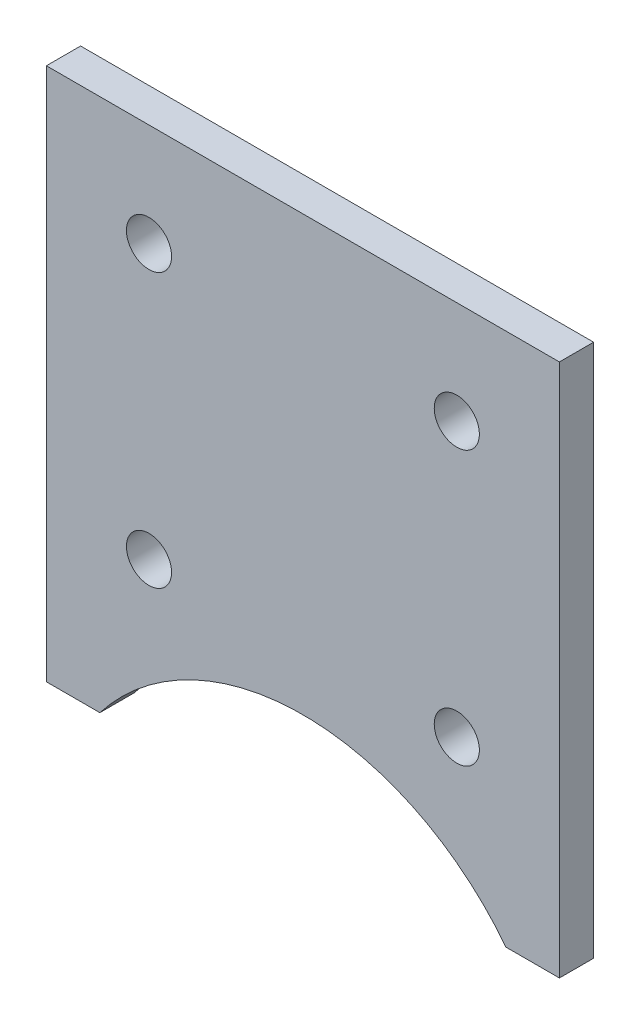
ISO-10303-21;
HEADER;
FILE_DESCRIPTION(('STEP AP214'),'2;1');
FILE_NAME('part.step','',(''),(''),'','','');
FILE_SCHEMA(('AUTOMOTIVE_DESIGN { 1 0 10303 214 1 1 1 1 }'));
ENDSEC;
DATA;
#1=APPLICATION_CONTEXT('core data for automotive mechanical design processes');
#2=APPLICATION_PROTOCOL_DEFINITION('international standard','automotive_design',2000,#1);
#3=PRODUCT_CONTEXT('',#1,'mechanical');
#4=PRODUCT('Part','Part','',(#3));
#5=PRODUCT_RELATED_PRODUCT_CATEGORY('part','',(#4));
#6=PRODUCT_DEFINITION_FORMATION('','',#4);
#7=PRODUCT_DEFINITION_CONTEXT('part definition',#1,'design');
#8=PRODUCT_DEFINITION('design','',#6,#7);
#9=PRODUCT_DEFINITION_SHAPE('','',#8);
#10=(LENGTH_UNIT() NAMED_UNIT(*) SI_UNIT(.MILLI.,.METRE.));
#11=(NAMED_UNIT(*) PLANE_ANGLE_UNIT() SI_UNIT($,.RADIAN.));
#12=(NAMED_UNIT(*) SI_UNIT($,.STERADIAN.) SOLID_ANGLE_UNIT());
#13=UNCERTAINTY_MEASURE_WITH_UNIT(LENGTH_MEASURE(1.E-05),#10,'distance_accuracy_value','');
#14=(GEOMETRIC_REPRESENTATION_CONTEXT(3) GLOBAL_UNCERTAINTY_ASSIGNED_CONTEXT((#13)) GLOBAL_UNIT_ASSIGNED_CONTEXT((#10,
#11,#12)) REPRESENTATION_CONTEXT('',''));
#15=CARTESIAN_POINT('',(0.,0.,0.));
#16=DIRECTION('',(0.,0.,1.));
#17=DIRECTION('',(1.,0.,0.));
#18=AXIS2_PLACEMENT_3D('',#15,#16,#17);
#19=CARTESIAN_POINT('',(-37.5,22.9169234999319,5.));
#20=DIRECTION('',(0.,1.,0.));
#21=DIRECTION('',(-1.,0.,0.));
#22=AXIS2_PLACEMENT_3D('',#19,#20,#21);
#23=PLANE('',#22);
#24=DIRECTION('',(1.,0.,0.));
#25=VECTOR('',#24,1.);
#26=CARTESIAN_POINT('',(-37.5,22.9169234999319,0.));
#27=LINE('',#26,#25);
#28=CARTESIAN_POINT('',(-37.5,22.9169234999319,0.));
#29=VERTEX_POINT('',#28);
#30=CARTESIAN_POINT('',(-29.6827326453996,22.9169234999319,0.));
#31=VERTEX_POINT('',#30);
#32=EDGE_CURVE('E127',#29,#31,#27,.T.);
#33=ORIENTED_EDGE('',*,*,#32,.T.);
#34=DIRECTION('',(0.,0.,-1.));
#35=VECTOR('',#34,1.);
#36=CARTESIAN_POINT('',(-29.6827326453996,22.9169234999319,5.));
#37=LINE('',#36,#35);
#38=CARTESIAN_POINT('',(-29.6827326453996,22.9169234999319,5.));
#39=VERTEX_POINT('',#38);
#40=EDGE_CURVE('E45',#39,#31,#37,.T.);
#41=ORIENTED_EDGE('',*,*,#40,.F.);
#42=DIRECTION('',(1.,0.,0.));
#43=VECTOR('',#42,1.);
#44=CARTESIAN_POINT('',(-37.5,22.9169234999319,5.));
#45=LINE('',#44,#43);
#46=CARTESIAN_POINT('',(-37.5,22.9169234999319,5.));
#47=VERTEX_POINT('',#46);
#48=EDGE_CURVE('E111',#47,#39,#45,.T.);
#49=ORIENTED_EDGE('',*,*,#48,.F.);
#50=DIRECTION('',(0.,0.,-1.));
#51=VECTOR('',#50,1.);
#52=CARTESIAN_POINT('',(-37.5,22.9169234999319,5.));
#53=LINE('',#52,#51);
#54=EDGE_CURVE('E11',#47,#29,#53,.T.);
#55=ORIENTED_EDGE('',*,*,#54,.T.);
#56=EDGE_LOOP('',(#33,#41,#49,#55));
#57=FACE_BOUND('',#56,.T.);
#58=ADVANCED_FACE('F35',(#57),#23,.F.);
#59=CARTESIAN_POINT('',(0.,0.,5.));
#60=DIRECTION('',(0.,0.,-1.));
#61=DIRECTION('',(-1.,0.,0.));
#62=AXIS2_PLACEMENT_3D('',#59,#60,#61);
#63=CYLINDRICAL_SURFACE('',#62,37.5);
#64=CARTESIAN_POINT('',(0.,0.,0.));
#65=DIRECTION('',(0.,0.,1.));
#66=DIRECTION('',(1.,0.,0.));
#67=AXIS2_PLACEMENT_3D('',#64,#65,#66);
#68=CIRCLE('',#67,37.5);
#69=CARTESIAN_POINT('',(29.6827326453996,22.9169234999319,0.));
#70=VERTEX_POINT('',#69);
#71=EDGE_CURVE('E97',#70,#31,#68,.T.);
#72=ORIENTED_EDGE('',*,*,#71,.F.);
#73=DIRECTION('',(0.,0.,-1.));
#74=VECTOR('',#73,1.);
#75=CARTESIAN_POINT('',(29.6827326453996,22.9169234999319,5.));
#76=LINE('',#75,#74);
#77=CARTESIAN_POINT('',(29.6827326453996,22.9169234999319,5.));
#78=VERTEX_POINT('',#77);
#79=EDGE_CURVE('E91',#78,#70,#76,.T.);
#80=ORIENTED_EDGE('',*,*,#79,.F.);
#81=CARTESIAN_POINT('',(0.,0.,5.));
#82=DIRECTION('',(0.,0.,1.));
#83=DIRECTION('',(1.,0.,0.));
#84=AXIS2_PLACEMENT_3D('',#81,#82,#83);
#85=CIRCLE('',#84,37.5);
#86=EDGE_CURVE('E95',#78,#39,#85,.T.);
#87=ORIENTED_EDGE('',*,*,#86,.T.);
#88=ORIENTED_EDGE('',*,*,#40,.T.);
#89=EDGE_LOOP('',(#72,#80,#87,#88));
#90=FACE_BOUND('',#89,.T.);
#91=ADVANCED_FACE('F93',(#90),#63,.F.);
#92=CARTESIAN_POINT('',(29.6827326453996,22.9169234999319,5.));
#93=DIRECTION('',(0.,1.,0.));
#94=DIRECTION('',(0.,0.,1.));
#95=AXIS2_PLACEMENT_3D('',#92,#93,#94);
#96=PLANE('',#95);
#97=DIRECTION('',(1.,0.,0.));
#98=VECTOR('',#97,1.);
#99=CARTESIAN_POINT('',(29.6827326453996,22.9169234999319,0.));
#100=LINE('',#99,#98);
#101=CARTESIAN_POINT('',(37.5,22.9169234999319,0.));
#102=VERTEX_POINT('',#101);
#103=EDGE_CURVE('E124',#70,#102,#100,.T.);
#104=ORIENTED_EDGE('',*,*,#103,.T.);
#105=DIRECTION('',(0.,0.,-1.));
#106=VECTOR('',#105,1.);
#107=CARTESIAN_POINT('',(37.5,22.9169234999319,5.));
#108=LINE('',#107,#106);
#109=CARTESIAN_POINT('',(37.5,22.9169234999319,5.));
#110=VERTEX_POINT('',#109);
#111=EDGE_CURVE('E101',#110,#102,#108,.T.);
#112=ORIENTED_EDGE('',*,*,#111,.F.);
#113=DIRECTION('',(1.,0.,0.));
#114=VECTOR('',#113,1.);
#115=CARTESIAN_POINT('',(29.6827326453996,22.9169234999319,5.));
#116=LINE('',#115,#114);
#117=EDGE_CURVE('E105',#78,#110,#116,.T.);
#118=ORIENTED_EDGE('',*,*,#117,.F.);
#119=ORIENTED_EDGE('',*,*,#79,.T.);
#120=EDGE_LOOP('',(#104,#112,#118,#119));
#121=FACE_BOUND('',#120,.T.);
#122=ADVANCED_FACE('F106',(#121),#96,.F.);
#123=CARTESIAN_POINT('',(37.5,60.9169234999319,5.));
#124=DIRECTION('',(1.,0.,0.));
#125=DIRECTION('',(0.,1.,0.));
#126=AXIS2_PLACEMENT_3D('',#123,#124,#125);
#127=PLANE('',#126);
#128=DIRECTION('',(0.,-1.,0.));
#129=VECTOR('',#128,1.);
#130=CARTESIAN_POINT('',(37.5,60.9169234999319,0.));
#131=LINE('',#130,#129);
#132=CARTESIAN_POINT('',(37.5,100.916923499932,0.));
#133=VERTEX_POINT('',#132);
#134=EDGE_CURVE('E121',#133,#102,#131,.T.);
#135=ORIENTED_EDGE('',*,*,#134,.F.);
#136=DIRECTION('',(0.,0.,-1.));
#137=VECTOR('',#136,1.);
#138=CARTESIAN_POINT('',(37.5,100.916923499932,5.));
#139=LINE('',#138,#137);
#140=CARTESIAN_POINT('',(37.5,100.916923499932,5.));
#141=VERTEX_POINT('',#140);
#142=EDGE_CURVE('E130',#141,#133,#139,.T.);
#143=ORIENTED_EDGE('',*,*,#142,.F.);
#144=DIRECTION('',(0.,1.,0.));
#145=VECTOR('',#144,1.);
#146=CARTESIAN_POINT('',(37.5,60.9169234999319,5.));
#147=LINE('',#146,#145);
#148=EDGE_CURVE('E108',#110,#141,#147,.T.);
#149=ORIENTED_EDGE('',*,*,#148,.F.);
#150=ORIENTED_EDGE('',*,*,#111,.T.);
#151=EDGE_LOOP('',(#135,#143,#149,#150));
#152=FACE_BOUND('',#151,.T.);
#153=ADVANCED_FACE('F148',(#152),#127,.T.);
#154=CARTESIAN_POINT('',(-37.5,100.916923499932,5.));
#155=DIRECTION('',(0.,1.,0.));
#156=DIRECTION('',(0.,0.,1.));
#157=AXIS2_PLACEMENT_3D('',#154,#155,#156);
#158=PLANE('',#157);
#159=DIRECTION('',(1.,0.,0.));
#160=VECTOR('',#159,1.);
#161=CARTESIAN_POINT('',(-37.5,100.916923499932,0.));
#162=LINE('',#161,#160);
#163=CARTESIAN_POINT('',(-37.5,100.916923499932,0.));
#164=VERTEX_POINT('',#163);
#165=EDGE_CURVE('E117',#164,#133,#162,.T.);
#166=ORIENTED_EDGE('',*,*,#165,.F.);
#167=DIRECTION('',(0.,0.,-1.));
#168=VECTOR('',#167,1.);
#169=CARTESIAN_POINT('',(-37.5,100.916923499932,5.));
#170=LINE('',#169,#168);
#171=CARTESIAN_POINT('',(-37.5,100.916923499932,5.));
#172=VERTEX_POINT('',#171);
#173=EDGE_CURVE('E39',#172,#164,#170,.T.);
#174=ORIENTED_EDGE('',*,*,#173,.F.);
#175=DIRECTION('',(1.,0.,0.));
#176=VECTOR('',#175,1.);
#177=CARTESIAN_POINT('',(-37.5,100.916923499932,5.));
#178=LINE('',#177,#176);
#179=EDGE_CURVE('E142',#172,#141,#178,.T.);
#180=ORIENTED_EDGE('',*,*,#179,.T.);
#181=ORIENTED_EDGE('',*,*,#142,.T.);
#182=EDGE_LOOP('',(#166,#174,#180,#181));
#183=FACE_BOUND('',#182,.T.);
#184=ADVANCED_FACE('F137',(#183),#158,.T.);
#185=CARTESIAN_POINT('',(-37.5,60.9169234999319,5.));
#186=DIRECTION('',(-1.,0.,0.));
#187=DIRECTION('',(0.,0.,1.));
#188=AXIS2_PLACEMENT_3D('',#185,#186,#187);
#189=PLANE('',#188);
#190=DIRECTION('',(0.,1.,0.));
#191=VECTOR('',#190,1.);
#192=CARTESIAN_POINT('',(-37.5,60.9169234999319,0.));
#193=LINE('',#192,#191);
#194=EDGE_CURVE('E79',#29,#164,#193,.T.);
#195=ORIENTED_EDGE('',*,*,#194,.F.);
#196=ORIENTED_EDGE('',*,*,#54,.F.);
#197=DIRECTION('',(0.,1.,0.));
#198=VECTOR('',#197,1.);
#199=CARTESIAN_POINT('',(-37.5,22.9169234999319,5.));
#200=LINE('',#199,#198);
#201=EDGE_CURVE('E83',#47,#172,#200,.T.);
#202=ORIENTED_EDGE('',*,*,#201,.T.);
#203=ORIENTED_EDGE('',*,*,#173,.T.);
#204=EDGE_LOOP('',(#195,#196,#202,#203));
#205=FACE_BOUND('',#204,.T.);
#206=ADVANCED_FACE('F37',(#205),#189,.T.);
#207=CARTESIAN_POINT('',(0.,0.,5.));
#208=DIRECTION('',(0.,0.,1.));
#209=DIRECTION('',(1.,0.,0.));
#210=AXIS2_PLACEMENT_3D('',#207,#208,#209);
#211=PLANE('',#210);
#212=CARTESIAN_POINT('',(22.5,45.9169234999319,5.));
#213=DIRECTION('',(0.,0.,-1.));
#214=DIRECTION('',(-1.,0.,0.));
#215=AXIS2_PLACEMENT_3D('',#212,#213,#214);
#216=CIRCLE('',#215,3.29999999999999);
#217=CARTESIAN_POINT('',(19.2,45.9169234999319,5.));
#218=VERTEX_POINT('',#217);
#219=EDGE_CURVE('E210',#218,#218,#216,.T.);
#220=ORIENTED_EDGE('',*,*,#219,.T.);
#221=EDGE_LOOP('',(#220));
#222=FACE_BOUND('',#221,.T.);
#223=CARTESIAN_POINT('',(-22.5,45.9169234999319,5.));
#224=DIRECTION('',(0.,0.,-1.));
#225=DIRECTION('',(-1.,0.,0.));
#226=AXIS2_PLACEMENT_3D('',#223,#224,#225);
#227=CIRCLE('',#226,3.29999999999999);
#228=CARTESIAN_POINT('',(-25.8,45.9169234999319,5.));
#229=VERTEX_POINT('',#228);
#230=EDGE_CURVE('E221',#229,#229,#227,.T.);
#231=ORIENTED_EDGE('',*,*,#230,.T.);
#232=EDGE_LOOP('',(#231));
#233=FACE_BOUND('',#232,.T.);
#234=CARTESIAN_POINT('',(-22.5,85.9169234999319,5.));
#235=DIRECTION('',(0.,0.,-1.));
#236=DIRECTION('',(-1.,0.,0.));
#237=AXIS2_PLACEMENT_3D('',#234,#235,#236);
#238=CIRCLE('',#237,3.29999999999999);
#239=CARTESIAN_POINT('',(-25.8,85.9169234999319,5.));
#240=VERTEX_POINT('',#239);
#241=EDGE_CURVE('E230',#240,#240,#238,.T.);
#242=ORIENTED_EDGE('',*,*,#241,.T.);
#243=EDGE_LOOP('',(#242));
#244=FACE_BOUND('',#243,.T.);
#245=CARTESIAN_POINT('',(22.5,85.9169234999319,5.));
#246=DIRECTION('',(0.,0.,-1.));
#247=DIRECTION('',(-1.,0.,0.));
#248=AXIS2_PLACEMENT_3D('',#245,#246,#247);
#249=CIRCLE('',#248,3.29999999999999);
#250=CARTESIAN_POINT('',(19.2,85.9169234999319,5.));
#251=VERTEX_POINT('',#250);
#252=EDGE_CURVE('E118',#251,#251,#249,.T.);
#253=ORIENTED_EDGE('',*,*,#252,.T.);
#254=EDGE_LOOP('',(#253));
#255=FACE_BOUND('',#254,.T.);
#256=ORIENTED_EDGE('',*,*,#201,.F.);
#257=ORIENTED_EDGE('',*,*,#48,.T.);
#258=ORIENTED_EDGE('',*,*,#86,.F.);
#259=ORIENTED_EDGE('',*,*,#117,.T.);
#260=ORIENTED_EDGE('',*,*,#148,.T.);
#261=ORIENTED_EDGE('',*,*,#179,.F.);
#262=EDGE_LOOP('',(#256,#257,#258,#259,#260,#261));
#263=FACE_BOUND('',#262,.T.);
#264=ADVANCED_FACE('F110',(#222,#233,#244,#255,#263),#211,.T.);
#265=CARTESIAN_POINT('',(0.,0.,0.));
#266=DIRECTION('',(0.,0.,1.));
#267=DIRECTION('',(1.,0.,0.));
#268=AXIS2_PLACEMENT_3D('',#265,#266,#267);
#269=PLANE('',#268);
#270=CARTESIAN_POINT('',(22.5,45.9169234999319,0.));
#271=DIRECTION('',(0.,0.,-1.));
#272=DIRECTION('',(-1.,0.,0.));
#273=AXIS2_PLACEMENT_3D('',#270,#271,#272);
#274=CIRCLE('',#273,3.325);
#275=CARTESIAN_POINT('',(19.175,45.9169234999319,0.));
#276=VERTEX_POINT('',#275);
#277=EDGE_CURVE('E208',#276,#276,#274,.T.);
#278=ORIENTED_EDGE('',*,*,#277,.F.);
#279=EDGE_LOOP('',(#278));
#280=FACE_BOUND('',#279,.T.);
#281=CARTESIAN_POINT('',(-22.5,45.9169234999319,0.));
#282=DIRECTION('',(0.,0.,-1.));
#283=DIRECTION('',(-1.,0.,0.));
#284=AXIS2_PLACEMENT_3D('',#281,#282,#283);
#285=CIRCLE('',#284,3.325);
#286=CARTESIAN_POINT('',(-25.825,45.9169234999319,0.));
#287=VERTEX_POINT('',#286);
#288=EDGE_CURVE('E215',#287,#287,#285,.T.);
#289=ORIENTED_EDGE('',*,*,#288,.F.);
#290=EDGE_LOOP('',(#289));
#291=FACE_BOUND('',#290,.T.);
#292=CARTESIAN_POINT('',(-22.5,85.9169234999319,0.));
#293=DIRECTION('',(0.,0.,-1.));
#294=DIRECTION('',(-1.,0.,0.));
#295=AXIS2_PLACEMENT_3D('',#292,#293,#294);
#296=CIRCLE('',#295,3.325);
#297=CARTESIAN_POINT('',(-25.825,85.9169234999319,0.));
#298=VERTEX_POINT('',#297);
#299=EDGE_CURVE('E224',#298,#298,#296,.T.);
#300=ORIENTED_EDGE('',*,*,#299,.F.);
#301=EDGE_LOOP('',(#300));
#302=FACE_BOUND('',#301,.T.);
#303=CARTESIAN_POINT('',(22.5,85.9169234999319,0.));
#304=DIRECTION('',(0.,0.,-1.));
#305=DIRECTION('',(-1.,0.,0.));
#306=AXIS2_PLACEMENT_3D('',#303,#304,#305);
#307=CIRCLE('',#306,3.325);
#308=CARTESIAN_POINT('',(19.175,85.9169234999319,0.));
#309=VERTEX_POINT('',#308);
#310=EDGE_CURVE('E233',#309,#309,#307,.T.);
#311=ORIENTED_EDGE('',*,*,#310,.F.);
#312=EDGE_LOOP('',(#311));
#313=FACE_BOUND('',#312,.T.);
#314=ORIENTED_EDGE('',*,*,#32,.F.);
#315=ORIENTED_EDGE('',*,*,#194,.T.);
#316=ORIENTED_EDGE('',*,*,#165,.T.);
#317=ORIENTED_EDGE('',*,*,#134,.T.);
#318=ORIENTED_EDGE('',*,*,#103,.F.);
#319=ORIENTED_EDGE('',*,*,#71,.T.);
#320=EDGE_LOOP('',(#314,#315,#316,#317,#318,#319));
#321=FACE_BOUND('',#320,.T.);
#322=ADVANCED_FACE('F140',(#280,#291,#302,#313,#321),#269,.F.);
#323=CARTESIAN_POINT('',(22.5,85.9169234999319,0.));
#324=DIRECTION('',(0.,0.,-1.));
#325=DIRECTION('',(-1.,0.,0.));
#326=AXIS2_PLACEMENT_3D('',#323,#324,#325);
#327=CYLINDRICAL_SURFACE('',#326,3.29999999999999);
#328=ORIENTED_EDGE('',*,*,#252,.F.);
#329=EDGE_LOOP('',(#328));
#330=FACE_BOUND('',#329,.T.);
#331=CARTESIAN_POINT('',(22.5,85.9169234999319,0.0249999999999972));
#332=DIRECTION('',(0.,0.,-1.));
#333=DIRECTION('',(-1.,0.,0.));
#334=AXIS2_PLACEMENT_3D('',#331,#332,#333);
#335=CIRCLE('',#334,3.29999999999999);
#336=CARTESIAN_POINT('',(19.2,85.9169234999319,0.0249999999999972));
#337=VERTEX_POINT('',#336);
#338=EDGE_CURVE('E235',#337,#337,#335,.T.);
#339=ORIENTED_EDGE('',*,*,#338,.T.);
#340=EDGE_LOOP('',(#339));
#341=FACE_BOUND('',#340,.T.);
#342=ADVANCED_FACE('F165',(#330,#341),#327,.F.);
#343=CARTESIAN_POINT('',(22.5,85.9169234999319,0.));
#344=DIRECTION('',(0.,0.,-1.));
#345=DIRECTION('',(-1.,0.,0.));
#346=AXIS2_PLACEMENT_3D('',#343,#344,#345);
#347=CONICAL_SURFACE('',#346,3.325,0.78539816339776);
#348=ORIENTED_EDGE('',*,*,#338,.F.);
#349=EDGE_LOOP('',(#348));
#350=FACE_BOUND('',#349,.T.);
#351=ORIENTED_EDGE('',*,*,#310,.T.);
#352=EDGE_LOOP('',(#351));
#353=FACE_BOUND('',#352,.T.);
#354=ADVANCED_FACE('F172',(#350,#353),#347,.F.);
#355=CARTESIAN_POINT('',(-22.5,85.9169234999319,0.));
#356=DIRECTION('',(0.,0.,-1.));
#357=DIRECTION('',(-1.,0.,0.));
#358=AXIS2_PLACEMENT_3D('',#355,#356,#357);
#359=CYLINDRICAL_SURFACE('',#358,3.29999999999999);
#360=ORIENTED_EDGE('',*,*,#241,.F.);
#361=EDGE_LOOP('',(#360));
#362=FACE_BOUND('',#361,.T.);
#363=CARTESIAN_POINT('',(-22.5,85.9169234999319,0.0249999999999972));
#364=DIRECTION('',(0.,0.,-1.));
#365=DIRECTION('',(-1.,0.,0.));
#366=AXIS2_PLACEMENT_3D('',#363,#364,#365);
#367=CIRCLE('',#366,3.29999999999999);
#368=CARTESIAN_POINT('',(-25.8,85.9169234999319,0.0249999999999972));
#369=VERTEX_POINT('',#368);
#370=EDGE_CURVE('E227',#369,#369,#367,.T.);
#371=ORIENTED_EDGE('',*,*,#370,.T.);
#372=EDGE_LOOP('',(#371));
#373=FACE_BOUND('',#372,.T.);
#374=ADVANCED_FACE('F176',(#362,#373),#359,.F.);
#375=CARTESIAN_POINT('',(-22.5,85.9169234999319,0.));
#376=DIRECTION('',(0.,0.,-1.));
#377=DIRECTION('',(-1.,0.,0.));
#378=AXIS2_PLACEMENT_3D('',#375,#376,#377);
#379=CONICAL_SURFACE('',#378,3.325,0.78539816339776);
#380=ORIENTED_EDGE('',*,*,#370,.F.);
#381=EDGE_LOOP('',(#380));
#382=FACE_BOUND('',#381,.T.);
#383=ORIENTED_EDGE('',*,*,#299,.T.);
#384=EDGE_LOOP('',(#383));
#385=FACE_BOUND('',#384,.T.);
#386=ADVANCED_FACE('F180',(#382,#385),#379,.F.);
#387=CARTESIAN_POINT('',(-22.5,45.9169234999319,0.));
#388=DIRECTION('',(0.,0.,-1.));
#389=DIRECTION('',(-1.,0.,0.));
#390=AXIS2_PLACEMENT_3D('',#387,#388,#389);
#391=CYLINDRICAL_SURFACE('',#390,3.29999999999999);
#392=ORIENTED_EDGE('',*,*,#230,.F.);
#393=EDGE_LOOP('',(#392));
#394=FACE_BOUND('',#393,.T.);
#395=CARTESIAN_POINT('',(-22.5,45.9169234999319,0.0249999999999972));
#396=DIRECTION('',(0.,0.,-1.));
#397=DIRECTION('',(-1.,0.,0.));
#398=AXIS2_PLACEMENT_3D('',#395,#396,#397);
#399=CIRCLE('',#398,3.29999999999999);
#400=CARTESIAN_POINT('',(-25.8,45.9169234999319,0.0249999999999972));
#401=VERTEX_POINT('',#400);
#402=EDGE_CURVE('E218',#401,#401,#399,.T.);
#403=ORIENTED_EDGE('',*,*,#402,.T.);
#404=EDGE_LOOP('',(#403));
#405=FACE_BOUND('',#404,.T.);
#406=ADVANCED_FACE('F184',(#394,#405),#391,.F.);
#407=CARTESIAN_POINT('',(-22.5,45.9169234999319,0.));
#408=DIRECTION('',(0.,0.,-1.));
#409=DIRECTION('',(-1.,0.,0.));
#410=AXIS2_PLACEMENT_3D('',#407,#408,#409);
#411=CONICAL_SURFACE('',#410,3.325,0.78539816339776);
#412=ORIENTED_EDGE('',*,*,#402,.F.);
#413=EDGE_LOOP('',(#412));
#414=FACE_BOUND('',#413,.T.);
#415=ORIENTED_EDGE('',*,*,#288,.T.);
#416=EDGE_LOOP('',(#415));
#417=FACE_BOUND('',#416,.T.);
#418=ADVANCED_FACE('F188',(#414,#417),#411,.F.);
#419=CARTESIAN_POINT('',(22.5,45.9169234999319,0.));
#420=DIRECTION('',(0.,0.,-1.));
#421=DIRECTION('',(-1.,0.,0.));
#422=AXIS2_PLACEMENT_3D('',#419,#420,#421);
#423=CYLINDRICAL_SURFACE('',#422,3.29999999999999);
#424=ORIENTED_EDGE('',*,*,#219,.F.);
#425=EDGE_LOOP('',(#424));
#426=FACE_BOUND('',#425,.T.);
#427=CARTESIAN_POINT('',(22.5,45.9169234999319,0.0249999999999972));
#428=DIRECTION('',(0.,0.,-1.));
#429=DIRECTION('',(-1.,0.,0.));
#430=AXIS2_PLACEMENT_3D('',#427,#428,#429);
#431=CIRCLE('',#430,3.29999999999999);
#432=CARTESIAN_POINT('',(19.2,45.9169234999319,0.0249999999999972));
#433=VERTEX_POINT('',#432);
#434=EDGE_CURVE('E205',#433,#433,#431,.T.);
#435=ORIENTED_EDGE('',*,*,#434,.T.);
#436=EDGE_LOOP('',(#435));
#437=FACE_BOUND('',#436,.T.);
#438=ADVANCED_FACE('F192',(#426,#437),#423,.F.);
#439=CARTESIAN_POINT('',(22.5,45.9169234999319,0.));
#440=DIRECTION('',(0.,0.,-1.));
#441=DIRECTION('',(-1.,0.,0.));
#442=AXIS2_PLACEMENT_3D('',#439,#440,#441);
#443=CONICAL_SURFACE('',#442,3.325,0.78539816339776);
#444=ORIENTED_EDGE('',*,*,#434,.F.);
#445=EDGE_LOOP('',(#444));
#446=FACE_BOUND('',#445,.T.);
#447=ORIENTED_EDGE('',*,*,#277,.T.);
#448=EDGE_LOOP('',(#447));
#449=FACE_BOUND('',#448,.T.);
#450=ADVANCED_FACE('F196',(#446,#449),#443,.F.);
#451=CLOSED_SHELL('',(#58,#91,#122,#153,#184,#206,#264,#322,#342,#354,#374,#386,#406,#418,#438,#450));
#452=MANIFOLD_SOLID_BREP('B2',#451);
#453=ADVANCED_BREP_SHAPE_REPRESENTATION('',(#18,#452),#14);
#454=SHAPE_DEFINITION_REPRESENTATION(#9,#453);
ENDSEC;
END-ISO-10303-21;
